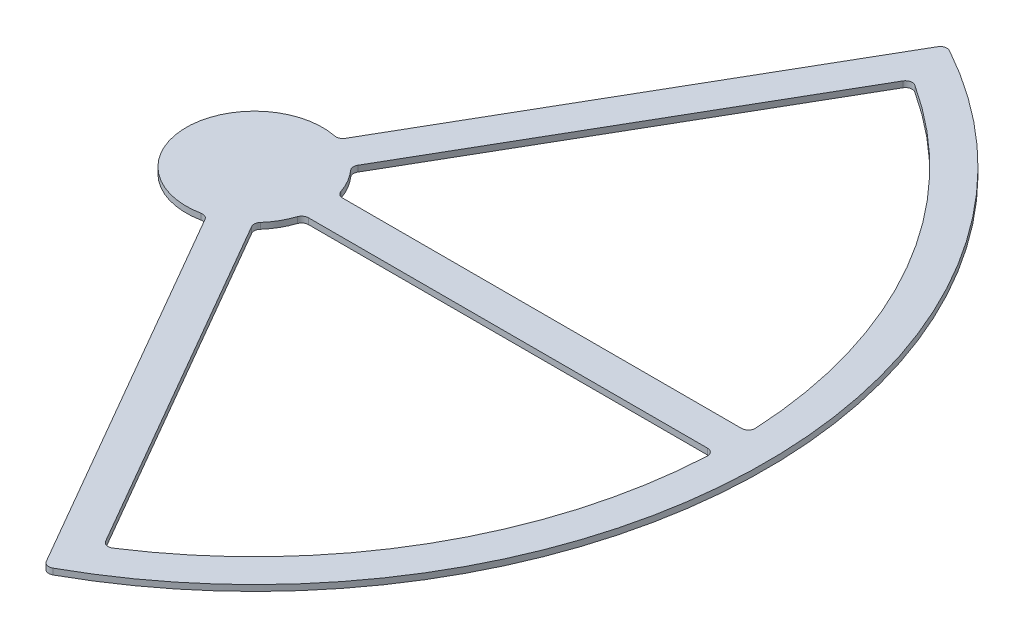
ISO-10303-21;
HEADER;
FILE_DESCRIPTION(('STEP AP214'),'2;1');
FILE_NAME('part.step','',(''),(''),'','','');
FILE_SCHEMA(('AUTOMOTIVE_DESIGN { 1 0 10303 214 1 1 1 1 }'));
ENDSEC;
DATA;
#1=APPLICATION_CONTEXT('core data for automotive mechanical design processes');
#2=APPLICATION_PROTOCOL_DEFINITION('international standard','automotive_design',2000,#1);
#3=PRODUCT_CONTEXT('',#1,'mechanical');
#4=PRODUCT('Part','Part','',(#3));
#5=PRODUCT_RELATED_PRODUCT_CATEGORY('part','',(#4));
#6=PRODUCT_DEFINITION_FORMATION('','',#4);
#7=PRODUCT_DEFINITION_CONTEXT('part definition',#1,'design');
#8=PRODUCT_DEFINITION('design','',#6,#7);
#9=PRODUCT_DEFINITION_SHAPE('','',#8);
#10=(LENGTH_UNIT() NAMED_UNIT(*) SI_UNIT(.MILLI.,.METRE.));
#11=(NAMED_UNIT(*) PLANE_ANGLE_UNIT() SI_UNIT($,.RADIAN.));
#12=(NAMED_UNIT(*) SI_UNIT($,.STERADIAN.) SOLID_ANGLE_UNIT());
#13=UNCERTAINTY_MEASURE_WITH_UNIT(LENGTH_MEASURE(1.E-05),#10,'distance_accuracy_value','');
#14=(GEOMETRIC_REPRESENTATION_CONTEXT(3) GLOBAL_UNCERTAINTY_ASSIGNED_CONTEXT((#13)) GLOBAL_UNIT_ASSIGNED_CONTEXT((#10,
#11,#12)) REPRESENTATION_CONTEXT('',''));
#15=CARTESIAN_POINT('',(0.,0.,0.));
#16=DIRECTION('',(0.,0.,1.));
#17=DIRECTION('',(1.,0.,0.));
#18=AXIS2_PLACEMENT_3D('',#15,#16,#17);
#19=CARTESIAN_POINT('',(71.3867195239865,1.75,129.645425201214));
#20=DIRECTION('',(0.,1.,0.));
#21=DIRECTION('',(0.,0.,1.));
#22=AXIS2_PLACEMENT_3D('',#19,#20,#21);
#23=PLANE('',#22);
#24=CARTESIAN_POINT('',(0.,1.75,0.));
#25=DIRECTION('',(0.,1.,0.));
#26=DIRECTION('',(0.,0.,1.));
#27=AXIS2_PLACEMENT_3D('',#24,#25,#26);
#28=CIRCLE('',#27,140.);
#29=CARTESIAN_POINT('',(76.0599228637533,1.75,117.536752269066));
#30=VERTEX_POINT('',#29);
#31=CARTESIAN_POINT('',(139.819774775206,1.75,7.10144927536232));
#32=VERTEX_POINT('',#31);
#33=EDGE_CURVE('E261',#30,#32,#28,.T.);
#34=ORIENTED_EDGE('',*,*,#33,.F.);
#35=CARTESIAN_POINT('',(74.9733525371282,1.75,115.85765580808));
#36=DIRECTION('',(0.,1.,0.));
#37=DIRECTION('',(0.,0.,1.));
#38=AXIS2_PLACEMENT_3D('',#35,#36,#37);
#39=CIRCLE('',#38,2.00000000000002);
#40=CARTESIAN_POINT('',(73.2413017295594,1.75,116.85765580808));
#41=VERTEX_POINT('',#40);
#42=EDGE_CURVE('E259',#41,#30,#39,.T.);
#43=ORIENTED_EDGE('',*,*,#42,.F.);
#44=DIRECTION('',(0.499999999999998,0.,0.86602540378444));
#45=VECTOR('',#44,1.);
#46=CARTESIAN_POINT('',(14.7584538262293,1.75,15.5623918681885));
#47=LINE('',#46,#45);
#48=CARTESIAN_POINT('',(14.7584538262293,1.75,15.5623918681885));
#49=VERTEX_POINT('',#48);
#50=EDGE_CURVE('E275',#49,#41,#47,.T.);
#51=ORIENTED_EDGE('',*,*,#50,.F.);
#52=CARTESIAN_POINT('',(16.4905046337981,1.75,14.5623918681885));
#53=DIRECTION('',(0.,1.,0.));
#54=DIRECTION('',(0.,0.,-1.));
#55=AXIS2_PLACEMENT_3D('',#52,#53,#54);
#56=CIRCLE('',#55,2.);
#57=CARTESIAN_POINT('',(14.9913678489074,1.75,13.2385380619895));
#58=VERTEX_POINT('',#57);
#59=EDGE_CURVE('E272',#58,#49,#56,.T.);
#60=ORIENTED_EDGE('',*,*,#59,.F.);
#61=CARTESIAN_POINT('',(0.,1.75,0.));
#62=DIRECTION('',(0.,-1.,0.));
#63=DIRECTION('',(0.,0.,1.));
#64=AXIS2_PLACEMENT_3D('',#61,#62,#63);
#65=CIRCLE('',#64,20.);
#66=CARTESIAN_POINT('',(18.9605941951038,1.75,6.36363636363636));
#67=VERTEX_POINT('',#66);
#68=EDGE_CURVE('E270',#67,#58,#65,.T.);
#69=ORIENTED_EDGE('',*,*,#68,.F.);
#70=CARTESIAN_POINT('',(20.8566536146142,1.75,7.));
#71=DIRECTION('',(0.,1.,0.));
#72=DIRECTION('',(0.,0.,1.));
#73=AXIS2_PLACEMENT_3D('',#70,#71,#72);
#74=CIRCLE('',#73,2.);
#75=CARTESIAN_POINT('',(20.8566536146142,1.75,5.));
#76=VERTEX_POINT('',#75);
#77=EDGE_CURVE('E268',#76,#67,#74,.T.);
#78=ORIENTED_EDGE('',*,*,#77,.F.);
#79=DIRECTION('',(-1.,0.,0.));
#80=VECTOR('',#79,1.);
#81=CARTESIAN_POINT('',(20.8566536146142,1.75,5.));
#82=LINE('',#81,#80);
#83=CARTESIAN_POINT('',(137.822349421275,1.75,5.));
#84=VERTEX_POINT('',#83);
#85=EDGE_CURVE('E266',#84,#76,#82,.T.);
#86=ORIENTED_EDGE('',*,*,#85,.F.);
#87=CARTESIAN_POINT('',(137.822349421275,1.75,7.));
#88=DIRECTION('',(0.,1.,0.));
#89=DIRECTION('',(0.,0.,-1.));
#90=AXIS2_PLACEMENT_3D('',#87,#88,#89);
#91=CIRCLE('',#90,1.99999999999999);
#92=EDGE_CURVE('E264',#32,#84,#91,.T.);
#93=ORIENTED_EDGE('',*,*,#92,.F.);
#94=EDGE_LOOP('',(#34,#43,#51,#60,#69,#78,#86,#93));
#95=FACE_BOUND('',#94,.T.);
#96=CARTESIAN_POINT('',(71.3867195239865,1.75,129.645425201214));
#97=DIRECTION('',(0.,1.,0.));
#98=DIRECTION('',(0.,0.,1.));
#99=AXIS2_PLACEMENT_3D('',#96,#97,#98);
#100=CIRCLE('',#99,2.00000000000003);
#101=CARTESIAN_POINT('',(69.6546687164176,1.75,130.645425201214));
#102=VERTEX_POINT('',#101);
#103=CARTESIAN_POINT('',(72.3514049229593,1.75,131.397390406636));
#104=VERTEX_POINT('',#103);
#105=EDGE_CURVE('E318',#102,#104,#100,.T.);
#106=ORIENTED_EDGE('',*,*,#105,.T.);
#107=CARTESIAN_POINT('',(0.,1.75,0.));
#108=DIRECTION('',(0.,1.,0.));
#109=DIRECTION('',(0.,0.,1.));
#110=AXIS2_PLACEMENT_3D('',#107,#108,#109);
#111=CIRCLE('',#110,150.);
#112=CARTESIAN_POINT('',(72.3514049229592,1.75,-131.397390406636));
#113=VERTEX_POINT('',#112);
#114=EDGE_CURVE('E321',#104,#113,#111,.T.);
#115=ORIENTED_EDGE('',*,*,#114,.T.);
#116=CARTESIAN_POINT('',(71.3867195239865,1.75,-129.645425201214));
#117=DIRECTION('',(0.,1.,0.));
#118=DIRECTION('',(0.,0.,-1.));
#119=AXIS2_PLACEMENT_3D('',#116,#117,#118);
#120=CIRCLE('',#119,1.99999999999998);
#121=CARTESIAN_POINT('',(69.6546687164176,1.75,-130.645425201214));
#122=VERTEX_POINT('',#121);
#123=EDGE_CURVE('E324',#113,#122,#120,.T.);
#124=ORIENTED_EDGE('',*,*,#123,.T.);
#125=DIRECTION('',(-0.499999999999998,0.,0.86602540378444));
#126=VECTOR('',#125,1.);
#127=CARTESIAN_POINT('',(6.09819978838486,1.75,-20.5623918681885));
#128=LINE('',#127,#126);
#129=CARTESIAN_POINT('',(6.09819978838486,1.75,-20.5623918681885));
#130=VERTEX_POINT('',#129);
#131=EDGE_CURVE('E326',#122,#130,#128,.T.);
#132=ORIENTED_EDGE('',*,*,#131,.T.);
#133=CARTESIAN_POINT('',(4.36614898081598,1.75,-21.5623918681885));
#134=DIRECTION('',(0.,-1.,0.));
#135=DIRECTION('',(0.,0.,-1.));
#136=AXIS2_PLACEMENT_3D('',#133,#134,#135);
#137=CIRCLE('',#136,2.);
#138=CARTESIAN_POINT('',(3.96922634619634,1.75,-19.6021744256259));
#139=VERTEX_POINT('',#138);
#140=EDGE_CURVE('E328',#130,#139,#137,.T.);
#141=ORIENTED_EDGE('',*,*,#140,.T.);
#142=CARTESIAN_POINT('',(0.,1.75,0.));
#143=DIRECTION('',(0.,1.,0.));
#144=DIRECTION('',(0.,0.,1.));
#145=AXIS2_PLACEMENT_3D('',#142,#143,#144);
#146=CIRCLE('',#145,20.);
#147=CARTESIAN_POINT('',(3.96922634619635,1.75,19.6021744256259));
#148=VERTEX_POINT('',#147);
#149=EDGE_CURVE('E330',#139,#148,#146,.T.);
#150=ORIENTED_EDGE('',*,*,#149,.T.);
#151=CARTESIAN_POINT('',(4.36614898081599,1.75,21.5623918681885));
#152=DIRECTION('',(0.,-1.,0.));
#153=DIRECTION('',(0.,0.,1.));
#154=AXIS2_PLACEMENT_3D('',#151,#152,#153);
#155=CIRCLE('',#154,2.);
#156=CARTESIAN_POINT('',(6.09819978838487,1.75,20.5623918681885));
#157=VERTEX_POINT('',#156);
#158=EDGE_CURVE('E332',#148,#157,#155,.T.);
#159=ORIENTED_EDGE('',*,*,#158,.T.);
#160=DIRECTION('',(0.499999999999998,0.,0.86602540378444));
#161=VECTOR('',#160,1.);
#162=CARTESIAN_POINT('',(6.09819978838487,1.75,20.5623918681885));
#163=LINE('',#162,#161);
#164=EDGE_CURVE('E334',#157,#102,#163,.T.);
#165=ORIENTED_EDGE('',*,*,#164,.T.);
#166=EDGE_LOOP('',(#106,#115,#124,#132,#141,#150,#159,#165));
#167=FACE_BOUND('',#166,.T.);
#168=DIRECTION('',(-0.499999999999998,0.,0.86602540378444));
#169=VECTOR('',#168,1.);
#170=CARTESIAN_POINT('',(14.7584538262293,1.75,-15.5623918681885));
#171=LINE('',#170,#169);
#172=CARTESIAN_POINT('',(73.2413017295594,1.75,-116.85765580808));
#173=VERTEX_POINT('',#172);
#174=CARTESIAN_POINT('',(14.7584538262293,1.75,-15.5623918681885));
#175=VERTEX_POINT('',#174);
#176=EDGE_CURVE('E202',#173,#175,#171,.T.);
#177=ORIENTED_EDGE('',*,*,#176,.F.);
#178=CARTESIAN_POINT('',(74.9733525371282,1.75,-115.85765580808));
#179=DIRECTION('',(0.,1.,0.));
#180=DIRECTION('',(0.,0.,-1.));
#181=AXIS2_PLACEMENT_3D('',#178,#179,#180);
#182=CIRCLE('',#181,1.99999999999999);
#183=CARTESIAN_POINT('',(76.0599228637533,1.75,-117.536752269066));
#184=VERTEX_POINT('',#183);
#185=EDGE_CURVE('E194',#184,#173,#182,.T.);
#186=ORIENTED_EDGE('',*,*,#185,.F.);
#187=CARTESIAN_POINT('',(0.,1.75,0.));
#188=DIRECTION('',(0.,1.,0.));
#189=DIRECTION('',(0.,0.,1.));
#190=AXIS2_PLACEMENT_3D('',#187,#188,#189);
#191=CIRCLE('',#190,140.);
#192=CARTESIAN_POINT('',(139.819774775206,1.75,-7.10144927536232));
#193=VERTEX_POINT('',#192);
#194=EDGE_CURVE('E227',#193,#184,#191,.T.);
#195=ORIENTED_EDGE('',*,*,#194,.F.);
#196=CARTESIAN_POINT('',(137.822349421275,1.75,-7.));
#197=DIRECTION('',(0.,1.,0.));
#198=DIRECTION('',(0.,0.,1.));
#199=AXIS2_PLACEMENT_3D('',#196,#197,#198);
#200=CIRCLE('',#199,1.99999999999999);
#201=CARTESIAN_POINT('',(137.822349421275,1.75,-5.));
#202=VERTEX_POINT('',#201);
#203=EDGE_CURVE('E225',#202,#193,#200,.T.);
#204=ORIENTED_EDGE('',*,*,#203,.F.);
#205=DIRECTION('',(1.,0.,0.));
#206=VECTOR('',#205,1.);
#207=CARTESIAN_POINT('',(20.8566536146142,1.75,-5.));
#208=LINE('',#207,#206);
#209=CARTESIAN_POINT('',(20.8566536146142,1.75,-5.));
#210=VERTEX_POINT('',#209);
#211=EDGE_CURVE('E223',#210,#202,#208,.T.);
#212=ORIENTED_EDGE('',*,*,#211,.F.);
#213=CARTESIAN_POINT('',(20.8566536146142,1.75,-7.));
#214=DIRECTION('',(0.,1.,0.));
#215=DIRECTION('',(0.,0.,-1.));
#216=AXIS2_PLACEMENT_3D('',#213,#214,#215);
#217=CIRCLE('',#216,2.);
#218=CARTESIAN_POINT('',(18.9605941951038,1.75,-6.36363636363637));
#219=VERTEX_POINT('',#218);
#220=EDGE_CURVE('E221',#219,#210,#217,.T.);
#221=ORIENTED_EDGE('',*,*,#220,.F.);
#222=CARTESIAN_POINT('',(0.,1.75,0.));
#223=DIRECTION('',(0.,-1.,0.));
#224=DIRECTION('',(0.,0.,1.));
#225=AXIS2_PLACEMENT_3D('',#222,#223,#224);
#226=CIRCLE('',#225,20.);
#227=CARTESIAN_POINT('',(14.9913678489074,1.75,-13.2385380619895));
#228=VERTEX_POINT('',#227);
#229=EDGE_CURVE('E217',#228,#219,#226,.T.);
#230=ORIENTED_EDGE('',*,*,#229,.F.);
#231=CARTESIAN_POINT('',(16.4905046337981,1.75,-14.5623918681885));
#232=DIRECTION('',(0.,1.,0.));
#233=DIRECTION('',(0.,0.,1.));
#234=AXIS2_PLACEMENT_3D('',#231,#232,#233);
#235=CIRCLE('',#234,2.);
#236=EDGE_CURVE('E215',#175,#228,#235,.T.);
#237=ORIENTED_EDGE('',*,*,#236,.F.);
#238=EDGE_LOOP('',(#177,#186,#195,#204,#212,#221,#230,#237));
#239=FACE_BOUND('',#238,.T.);
#240=ADVANCED_FACE('F33',(#95,#167,#239),#23,.T.);
#241=CARTESIAN_POINT('',(71.3867195239865,0.,129.645425201214));
#242=DIRECTION('',(0.,1.,0.));
#243=DIRECTION('',(0.,0.,1.));
#244=AXIS2_PLACEMENT_3D('',#241,#242,#243);
#245=PLANE('',#244);
#246=CARTESIAN_POINT('',(74.9733525371282,0.,115.85765580808));
#247=DIRECTION('',(0.,1.,0.));
#248=DIRECTION('',(0.,0.,1.));
#249=AXIS2_PLACEMENT_3D('',#246,#247,#248);
#250=CIRCLE('',#249,2.00000000000002);
#251=CARTESIAN_POINT('',(73.2413017295594,0.,116.85765580808));
#252=VERTEX_POINT('',#251);
#253=CARTESIAN_POINT('',(76.0599228637533,0.,117.536752269066));
#254=VERTEX_POINT('',#253);
#255=EDGE_CURVE('E210',#252,#254,#250,.T.);
#256=ORIENTED_EDGE('',*,*,#255,.T.);
#257=CARTESIAN_POINT('',(0.,0.,0.));
#258=DIRECTION('',(0.,1.,0.));
#259=DIRECTION('',(0.,0.,1.));
#260=AXIS2_PLACEMENT_3D('',#257,#258,#259);
#261=CIRCLE('',#260,140.);
#262=CARTESIAN_POINT('',(139.819774775206,0.,7.10144927536232));
#263=VERTEX_POINT('',#262);
#264=EDGE_CURVE('E280',#254,#263,#261,.T.);
#265=ORIENTED_EDGE('',*,*,#264,.T.);
#266=CARTESIAN_POINT('',(137.822349421275,0.,7.));
#267=DIRECTION('',(0.,1.,0.));
#268=DIRECTION('',(0.,0.,-1.));
#269=AXIS2_PLACEMENT_3D('',#266,#267,#268);
#270=CIRCLE('',#269,1.99999999999999);
#271=CARTESIAN_POINT('',(137.822349421275,0.,5.));
#272=VERTEX_POINT('',#271);
#273=EDGE_CURVE('E283',#263,#272,#270,.T.);
#274=ORIENTED_EDGE('',*,*,#273,.T.);
#275=DIRECTION('',(-1.,0.,0.));
#276=VECTOR('',#275,1.);
#277=CARTESIAN_POINT('',(20.8566536146142,0.,5.));
#278=LINE('',#277,#276);
#279=CARTESIAN_POINT('',(20.8566536146142,0.,5.));
#280=VERTEX_POINT('',#279);
#281=EDGE_CURVE('E286',#272,#280,#278,.T.);
#282=ORIENTED_EDGE('',*,*,#281,.T.);
#283=CARTESIAN_POINT('',(20.8566536146142,0.,7.));
#284=DIRECTION('',(0.,1.,0.));
#285=DIRECTION('',(0.,0.,1.));
#286=AXIS2_PLACEMENT_3D('',#283,#284,#285);
#287=CIRCLE('',#286,2.);
#288=CARTESIAN_POINT('',(18.9605941951038,0.,6.36363636363636));
#289=VERTEX_POINT('',#288);
#290=EDGE_CURVE('E289',#280,#289,#287,.T.);
#291=ORIENTED_EDGE('',*,*,#290,.T.);
#292=CARTESIAN_POINT('',(0.,0.,0.));
#293=DIRECTION('',(0.,-1.,0.));
#294=DIRECTION('',(0.,0.,1.));
#295=AXIS2_PLACEMENT_3D('',#292,#293,#294);
#296=CIRCLE('',#295,20.);
#297=CARTESIAN_POINT('',(14.9913678489074,0.,13.2385380619895));
#298=VERTEX_POINT('',#297);
#299=EDGE_CURVE('E292',#289,#298,#296,.T.);
#300=ORIENTED_EDGE('',*,*,#299,.T.);
#301=CARTESIAN_POINT('',(16.4905046337981,0.,14.5623918681885));
#302=DIRECTION('',(0.,1.,0.));
#303=DIRECTION('',(0.,0.,-1.));
#304=AXIS2_PLACEMENT_3D('',#301,#302,#303);
#305=CIRCLE('',#304,2.);
#306=CARTESIAN_POINT('',(14.7584538262293,0.,15.5623918681885));
#307=VERTEX_POINT('',#306);
#308=EDGE_CURVE('E295',#298,#307,#305,.T.);
#309=ORIENTED_EDGE('',*,*,#308,.T.);
#310=DIRECTION('',(0.499999999999998,0.,0.86602540378444));
#311=VECTOR('',#310,1.);
#312=CARTESIAN_POINT('',(14.7584538262293,0.,15.5623918681885));
#313=LINE('',#312,#311);
#314=EDGE_CURVE('E262',#307,#252,#313,.T.);
#315=ORIENTED_EDGE('',*,*,#314,.T.);
#316=EDGE_LOOP('',(#256,#265,#274,#282,#291,#300,#309,#315));
#317=FACE_BOUND('',#316,.T.);
#318=CARTESIAN_POINT('',(71.3867195239865,0.,129.645425201214));
#319=DIRECTION('',(0.,1.,0.));
#320=DIRECTION('',(0.,0.,1.));
#321=AXIS2_PLACEMENT_3D('',#318,#319,#320);
#322=CIRCLE('',#321,2.00000000000003);
#323=CARTESIAN_POINT('',(69.6546687164176,0.,130.645425201214));
#324=VERTEX_POINT('',#323);
#325=CARTESIAN_POINT('',(72.3514049229593,0.,131.397390406636));
#326=VERTEX_POINT('',#325);
#327=EDGE_CURVE('E317',#324,#326,#322,.T.);
#328=ORIENTED_EDGE('',*,*,#327,.F.);
#329=DIRECTION('',(0.499999999999998,0.,0.86602540378444));
#330=VECTOR('',#329,1.);
#331=CARTESIAN_POINT('',(6.09819978838487,0.,20.5623918681885));
#332=LINE('',#331,#330);
#333=CARTESIAN_POINT('',(6.09819978838487,0.,20.5623918681885));
#334=VERTEX_POINT('',#333);
#335=EDGE_CURVE('E322',#334,#324,#332,.T.);
#336=ORIENTED_EDGE('',*,*,#335,.F.);
#337=CARTESIAN_POINT('',(4.36614898081599,0.,21.5623918681885));
#338=DIRECTION('',(0.,-1.,0.));
#339=DIRECTION('',(0.,0.,1.));
#340=AXIS2_PLACEMENT_3D('',#337,#338,#339);
#341=CIRCLE('',#340,2.);
#342=CARTESIAN_POINT('',(3.96922634619635,0.,19.6021744256259));
#343=VERTEX_POINT('',#342);
#344=EDGE_CURVE('E349',#343,#334,#341,.T.);
#345=ORIENTED_EDGE('',*,*,#344,.F.);
#346=CARTESIAN_POINT('',(0.,0.,0.));
#347=DIRECTION('',(0.,1.,0.));
#348=DIRECTION('',(0.,0.,1.));
#349=AXIS2_PLACEMENT_3D('',#346,#347,#348);
#350=CIRCLE('',#349,20.);
#351=CARTESIAN_POINT('',(3.96922634619634,0.,-19.6021744256259));
#352=VERTEX_POINT('',#351);
#353=EDGE_CURVE('E347',#352,#343,#350,.T.);
#354=ORIENTED_EDGE('',*,*,#353,.F.);
#355=CARTESIAN_POINT('',(4.36614898081598,0.,-21.5623918681885));
#356=DIRECTION('',(0.,-1.,0.));
#357=DIRECTION('',(0.,0.,-1.));
#358=AXIS2_PLACEMENT_3D('',#355,#356,#357);
#359=CIRCLE('',#358,2.);
#360=CARTESIAN_POINT('',(6.09819978838486,0.,-20.5623918681885));
#361=VERTEX_POINT('',#360);
#362=EDGE_CURVE('E345',#361,#352,#359,.T.);
#363=ORIENTED_EDGE('',*,*,#362,.F.);
#364=DIRECTION('',(-0.499999999999998,0.,0.86602540378444));
#365=VECTOR('',#364,1.);
#366=CARTESIAN_POINT('',(6.09819978838486,0.,-20.5623918681885));
#367=LINE('',#366,#365);
#368=CARTESIAN_POINT('',(69.6546687164176,0.,-130.645425201214));
#369=VERTEX_POINT('',#368);
#370=EDGE_CURVE('E343',#369,#361,#367,.T.);
#371=ORIENTED_EDGE('',*,*,#370,.F.);
#372=CARTESIAN_POINT('',(71.3867195239865,0.,-129.645425201214));
#373=DIRECTION('',(0.,1.,0.));
#374=DIRECTION('',(0.,0.,-1.));
#375=AXIS2_PLACEMENT_3D('',#372,#373,#374);
#376=CIRCLE('',#375,1.99999999999998);
#377=CARTESIAN_POINT('',(72.3514049229592,0.,-131.397390406636));
#378=VERTEX_POINT('',#377);
#379=EDGE_CURVE('E341',#378,#369,#376,.T.);
#380=ORIENTED_EDGE('',*,*,#379,.F.);
#381=CARTESIAN_POINT('',(0.,0.,0.));
#382=DIRECTION('',(0.,1.,0.));
#383=DIRECTION('',(0.,0.,1.));
#384=AXIS2_PLACEMENT_3D('',#381,#382,#383);
#385=CIRCLE('',#384,150.);
#386=EDGE_CURVE('E339',#326,#378,#385,.T.);
#387=ORIENTED_EDGE('',*,*,#386,.F.);
#388=EDGE_LOOP('',(#328,#336,#345,#354,#363,#371,#380,#387));
#389=FACE_BOUND('',#388,.T.);
#390=CARTESIAN_POINT('',(74.9733525371282,0.,-115.85765580808));
#391=DIRECTION('',(0.,1.,0.));
#392=DIRECTION('',(0.,0.,-1.));
#393=AXIS2_PLACEMENT_3D('',#390,#391,#392);
#394=CIRCLE('',#393,1.99999999999999);
#395=CARTESIAN_POINT('',(76.0599228637533,0.,-117.536752269066));
#396=VERTEX_POINT('',#395);
#397=CARTESIAN_POINT('',(73.2413017295594,0.,-116.85765580808));
#398=VERTEX_POINT('',#397);
#399=EDGE_CURVE('E56',#396,#398,#394,.T.);
#400=ORIENTED_EDGE('',*,*,#399,.T.);
#401=DIRECTION('',(-0.499999999999998,0.,0.86602540378444));
#402=VECTOR('',#401,1.);
#403=CARTESIAN_POINT('',(14.7584538262293,0.,-15.5623918681885));
#404=LINE('',#403,#402);
#405=CARTESIAN_POINT('',(14.7584538262293,0.,-15.5623918681885));
#406=VERTEX_POINT('',#405);
#407=EDGE_CURVE('E209',#398,#406,#404,.T.);
#408=ORIENTED_EDGE('',*,*,#407,.T.);
#409=CARTESIAN_POINT('',(16.4905046337981,0.,-14.5623918681885));
#410=DIRECTION('',(0.,1.,0.));
#411=DIRECTION('',(0.,0.,1.));
#412=AXIS2_PLACEMENT_3D('',#409,#410,#411);
#413=CIRCLE('',#412,2.);
#414=CARTESIAN_POINT('',(14.9913678489074,0.,-13.2385380619895));
#415=VERTEX_POINT('',#414);
#416=EDGE_CURVE('E231',#406,#415,#413,.T.);
#417=ORIENTED_EDGE('',*,*,#416,.T.);
#418=CARTESIAN_POINT('',(0.,0.,0.));
#419=DIRECTION('',(0.,-1.,0.));
#420=DIRECTION('',(0.,0.,1.));
#421=AXIS2_PLACEMENT_3D('',#418,#419,#420);
#422=CIRCLE('',#421,20.);
#423=CARTESIAN_POINT('',(18.9605941951038,0.,-6.36363636363637));
#424=VERTEX_POINT('',#423);
#425=EDGE_CURVE('E234',#415,#424,#422,.T.);
#426=ORIENTED_EDGE('',*,*,#425,.T.);
#427=CARTESIAN_POINT('',(20.8566536146142,0.,-7.));
#428=DIRECTION('',(0.,1.,0.));
#429=DIRECTION('',(0.,0.,-1.));
#430=AXIS2_PLACEMENT_3D('',#427,#428,#429);
#431=CIRCLE('',#430,2.);
#432=CARTESIAN_POINT('',(20.8566536146142,0.,-5.));
#433=VERTEX_POINT('',#432);
#434=EDGE_CURVE('E237',#424,#433,#431,.T.);
#435=ORIENTED_EDGE('',*,*,#434,.T.);
#436=DIRECTION('',(1.,0.,0.));
#437=VECTOR('',#436,1.);
#438=CARTESIAN_POINT('',(20.8566536146142,0.,-5.));
#439=LINE('',#438,#437);
#440=CARTESIAN_POINT('',(137.822349421275,0.,-5.));
#441=VERTEX_POINT('',#440);
#442=EDGE_CURVE('E240',#433,#441,#439,.T.);
#443=ORIENTED_EDGE('',*,*,#442,.T.);
#444=CARTESIAN_POINT('',(137.822349421275,0.,-7.));
#445=DIRECTION('',(0.,1.,0.));
#446=DIRECTION('',(0.,0.,1.));
#447=AXIS2_PLACEMENT_3D('',#444,#445,#446);
#448=CIRCLE('',#447,1.99999999999999);
#449=CARTESIAN_POINT('',(139.819774775206,0.,-7.10144927536232));
#450=VERTEX_POINT('',#449);
#451=EDGE_CURVE('E243',#441,#450,#448,.T.);
#452=ORIENTED_EDGE('',*,*,#451,.T.);
#453=CARTESIAN_POINT('',(0.,0.,0.));
#454=DIRECTION('',(0.,1.,0.));
#455=DIRECTION('',(0.,0.,1.));
#456=AXIS2_PLACEMENT_3D('',#453,#454,#455);
#457=CIRCLE('',#456,140.);
#458=EDGE_CURVE('E203',#450,#396,#457,.T.);
#459=ORIENTED_EDGE('',*,*,#458,.T.);
#460=EDGE_LOOP('',(#400,#408,#417,#426,#435,#443,#452,#459));
#461=FACE_BOUND('',#460,.T.);
#462=ADVANCED_FACE('F379',(#317,#389,#461),#245,.F.);
#463=CARTESIAN_POINT('',(71.3867195239865,1.75,129.645425201214));
#464=DIRECTION('',(0.,-1.,0.));
#465=DIRECTION('',(0.,0.,-1.));
#466=AXIS2_PLACEMENT_3D('',#463,#464,#465);
#467=CYLINDRICAL_SURFACE('',#466,2.00000000000003);
#468=ORIENTED_EDGE('',*,*,#327,.T.);
#469=DIRECTION('',(0.,-1.,0.));
#470=VECTOR('',#469,1.);
#471=CARTESIAN_POINT('',(72.3514049229593,1.75,131.397390406636));
#472=LINE('',#471,#470);
#473=EDGE_CURVE('E11',#104,#326,#472,.T.);
#474=ORIENTED_EDGE('',*,*,#473,.F.);
#475=ORIENTED_EDGE('',*,*,#105,.F.);
#476=DIRECTION('',(0.,-1.,0.));
#477=VECTOR('',#476,1.);
#478=CARTESIAN_POINT('',(69.6546687164176,1.75,130.645425201214));
#479=LINE('',#478,#477);
#480=EDGE_CURVE('E336',#102,#324,#479,.T.);
#481=ORIENTED_EDGE('',*,*,#480,.T.);
#482=EDGE_LOOP('',(#468,#474,#475,#481));
#483=FACE_BOUND('',#482,.T.);
#484=ADVANCED_FACE('F35',(#483),#467,.T.);
#485=CARTESIAN_POINT('',(0.,1.75,0.));
#486=DIRECTION('',(0.,-1.,0.));
#487=DIRECTION('',(0.,0.,-1.));
#488=AXIS2_PLACEMENT_3D('',#485,#486,#487);
#489=CYLINDRICAL_SURFACE('',#488,150.);
#490=ORIENTED_EDGE('',*,*,#386,.T.);
#491=DIRECTION('',(0.,-1.,0.));
#492=VECTOR('',#491,1.);
#493=CARTESIAN_POINT('',(72.3514049229592,1.75,-131.397390406636));
#494=LINE('',#493,#492);
#495=EDGE_CURVE('E41',#113,#378,#494,.T.);
#496=ORIENTED_EDGE('',*,*,#495,.F.);
#497=ORIENTED_EDGE('',*,*,#114,.F.);
#498=ORIENTED_EDGE('',*,*,#473,.T.);
#499=EDGE_LOOP('',(#490,#496,#497,#498));
#500=FACE_BOUND('',#499,.T.);
#501=ADVANCED_FACE('F396',(#500),#489,.T.);
#502=CARTESIAN_POINT('',(71.3867195239865,1.75,-129.645425201214));
#503=DIRECTION('',(0.,-1.,0.));
#504=DIRECTION('',(0.,0.,-1.));
#505=AXIS2_PLACEMENT_3D('',#502,#503,#504);
#506=CYLINDRICAL_SURFACE('',#505,1.99999999999998);
#507=ORIENTED_EDGE('',*,*,#379,.T.);
#508=DIRECTION('',(0.,-1.,0.));
#509=VECTOR('',#508,1.);
#510=CARTESIAN_POINT('',(69.6546687164176,1.75,-130.645425201214));
#511=LINE('',#510,#509);
#512=EDGE_CURVE('E366',#122,#369,#511,.T.);
#513=ORIENTED_EDGE('',*,*,#512,.F.);
#514=ORIENTED_EDGE('',*,*,#123,.F.);
#515=ORIENTED_EDGE('',*,*,#495,.T.);
#516=EDGE_LOOP('',(#507,#513,#514,#515));
#517=FACE_BOUND('',#516,.T.);
#518=ADVANCED_FACE('F373',(#517),#506,.T.);
#519=CARTESIAN_POINT('',(6.09819978838486,1.75,-20.5623918681885));
#520=DIRECTION('',(0.86602540378444,0.,0.499999999999998));
#521=DIRECTION('',(0.499999999999998,0.,-0.86602540378444));
#522=AXIS2_PLACEMENT_3D('',#519,#520,#521);
#523=PLANE('',#522);
#524=ORIENTED_EDGE('',*,*,#370,.T.);
#525=DIRECTION('',(0.,-1.,0.));
#526=VECTOR('',#525,1.);
#527=CARTESIAN_POINT('',(6.09819978838486,1.75,-20.5623918681885));
#528=LINE('',#527,#526);
#529=EDGE_CURVE('E363',#130,#361,#528,.T.);
#530=ORIENTED_EDGE('',*,*,#529,.F.);
#531=ORIENTED_EDGE('',*,*,#131,.F.);
#532=ORIENTED_EDGE('',*,*,#512,.T.);
#533=EDGE_LOOP('',(#524,#530,#531,#532));
#534=FACE_BOUND('',#533,.T.);
#535=ADVANCED_FACE('F385',(#534),#523,.F.);
#536=CARTESIAN_POINT('',(4.36614898081598,1.75,-21.5623918681885));
#537=DIRECTION('',(0.,-1.,0.));
#538=DIRECTION('',(0.,0.,-1.));
#539=AXIS2_PLACEMENT_3D('',#536,#537,#538);
#540=CYLINDRICAL_SURFACE('',#539,2.);
#541=ORIENTED_EDGE('',*,*,#362,.T.);
#542=DIRECTION('',(0.,-1.,0.));
#543=VECTOR('',#542,1.);
#544=CARTESIAN_POINT('',(3.96922634619634,1.75,-19.6021744256259));
#545=LINE('',#544,#543);
#546=EDGE_CURVE('E360',#139,#352,#545,.T.);
#547=ORIENTED_EDGE('',*,*,#546,.F.);
#548=ORIENTED_EDGE('',*,*,#140,.F.);
#549=ORIENTED_EDGE('',*,*,#529,.T.);
#550=EDGE_LOOP('',(#541,#547,#548,#549));
#551=FACE_BOUND('',#550,.T.);
#552=ADVANCED_FACE('F389',(#551),#540,.F.);
#553=CARTESIAN_POINT('',(0.,1.75,0.));
#554=DIRECTION('',(0.,-1.,0.));
#555=DIRECTION('',(0.,0.,-1.));
#556=AXIS2_PLACEMENT_3D('',#553,#554,#555);
#557=CYLINDRICAL_SURFACE('',#556,20.);
#558=ORIENTED_EDGE('',*,*,#353,.T.);
#559=DIRECTION('',(0.,-1.,0.));
#560=VECTOR('',#559,1.);
#561=CARTESIAN_POINT('',(3.96922634619635,1.75,19.6021744256259));
#562=LINE('',#561,#560);
#563=EDGE_CURVE('E357',#148,#343,#562,.T.);
#564=ORIENTED_EDGE('',*,*,#563,.F.);
#565=ORIENTED_EDGE('',*,*,#149,.F.);
#566=ORIENTED_EDGE('',*,*,#546,.T.);
#567=EDGE_LOOP('',(#558,#564,#565,#566));
#568=FACE_BOUND('',#567,.T.);
#569=ADVANCED_FACE('F409',(#568),#557,.T.);
#570=CARTESIAN_POINT('',(4.36614898081599,1.75,21.5623918681885));
#571=DIRECTION('',(0.,-1.,0.));
#572=DIRECTION('',(0.,0.,-1.));
#573=AXIS2_PLACEMENT_3D('',#570,#571,#572);
#574=CYLINDRICAL_SURFACE('',#573,2.);
#575=ORIENTED_EDGE('',*,*,#344,.T.);
#576=DIRECTION('',(0.,-1.,0.));
#577=VECTOR('',#576,1.);
#578=CARTESIAN_POINT('',(6.09819978838487,1.75,20.5623918681885));
#579=LINE('',#578,#577);
#580=EDGE_CURVE('E354',#157,#334,#579,.T.);
#581=ORIENTED_EDGE('',*,*,#580,.F.);
#582=ORIENTED_EDGE('',*,*,#158,.F.);
#583=ORIENTED_EDGE('',*,*,#563,.T.);
#584=EDGE_LOOP('',(#575,#581,#582,#583));
#585=FACE_BOUND('',#584,.T.);
#586=ADVANCED_FACE('F407',(#585),#574,.F.);
#587=CARTESIAN_POINT('',(6.09819978838487,1.75,20.5623918681885));
#588=DIRECTION('',(0.86602540378444,0.,-0.499999999999998));
#589=DIRECTION('',(-0.499999999999998,0.,-0.86602540378444));
#590=AXIS2_PLACEMENT_3D('',#587,#588,#589);
#591=PLANE('',#590);
#592=ORIENTED_EDGE('',*,*,#335,.T.);
#593=ORIENTED_EDGE('',*,*,#480,.F.);
#594=ORIENTED_EDGE('',*,*,#164,.F.);
#595=ORIENTED_EDGE('',*,*,#580,.T.);
#596=EDGE_LOOP('',(#592,#593,#594,#595));
#597=FACE_BOUND('',#596,.T.);
#598=ADVANCED_FACE('F402',(#597),#591,.F.);
#599=CARTESIAN_POINT('',(74.9733525371282,1.75,115.85765580808));
#600=DIRECTION('',(0.,-1.,0.));
#601=DIRECTION('',(0.,0.,-1.));
#602=AXIS2_PLACEMENT_3D('',#599,#600,#601);
#603=CYLINDRICAL_SURFACE('',#602,2.00000000000002);
#604=ORIENTED_EDGE('',*,*,#255,.F.);
#605=DIRECTION('',(0.,-1.,0.));
#606=VECTOR('',#605,1.);
#607=CARTESIAN_POINT('',(73.2413017295594,1.75,116.85765580808));
#608=LINE('',#607,#606);
#609=EDGE_CURVE('E277',#41,#252,#608,.T.);
#610=ORIENTED_EDGE('',*,*,#609,.F.);
#611=ORIENTED_EDGE('',*,*,#42,.T.);
#612=DIRECTION('',(0.,-1.,0.));
#613=VECTOR('',#612,1.);
#614=CARTESIAN_POINT('',(76.0599228637533,1.75,117.536752269066));
#615=LINE('',#614,#613);
#616=EDGE_CURVE('E314',#30,#254,#615,.T.);
#617=ORIENTED_EDGE('',*,*,#616,.T.);
#618=EDGE_LOOP('',(#604,#610,#611,#617));
#619=FACE_BOUND('',#618,.T.);
#620=ADVANCED_FACE('F428',(#619),#603,.F.);
#621=CARTESIAN_POINT('',(0.,1.75,0.));
#622=DIRECTION('',(0.,-1.,0.));
#623=DIRECTION('',(0.,0.,-1.));
#624=AXIS2_PLACEMENT_3D('',#621,#622,#623);
#625=CYLINDRICAL_SURFACE('',#624,140.);
#626=ORIENTED_EDGE('',*,*,#264,.F.);
#627=ORIENTED_EDGE('',*,*,#616,.F.);
#628=ORIENTED_EDGE('',*,*,#33,.T.);
#629=DIRECTION('',(0.,-1.,0.));
#630=VECTOR('',#629,1.);
#631=CARTESIAN_POINT('',(139.819774775206,1.75,7.10144927536232));
#632=LINE('',#631,#630);
#633=EDGE_CURVE('E312',#32,#263,#632,.T.);
#634=ORIENTED_EDGE('',*,*,#633,.T.);
#635=EDGE_LOOP('',(#626,#627,#628,#634));
#636=FACE_BOUND('',#635,.T.);
#637=ADVANCED_FACE('F435',(#636),#625,.F.);
#638=CARTESIAN_POINT('',(137.822349421275,1.75,7.));
#639=DIRECTION('',(0.,-1.,0.));
#640=DIRECTION('',(0.,0.,-1.));
#641=AXIS2_PLACEMENT_3D('',#638,#639,#640);
#642=CYLINDRICAL_SURFACE('',#641,1.99999999999999);
#643=ORIENTED_EDGE('',*,*,#273,.F.);
#644=ORIENTED_EDGE('',*,*,#633,.F.);
#645=ORIENTED_EDGE('',*,*,#92,.T.);
#646=DIRECTION('',(0.,-1.,0.));
#647=VECTOR('',#646,1.);
#648=CARTESIAN_POINT('',(137.822349421275,1.75,5.));
#649=LINE('',#648,#647);
#650=EDGE_CURVE('E310',#84,#272,#649,.T.);
#651=ORIENTED_EDGE('',*,*,#650,.T.);
#652=EDGE_LOOP('',(#643,#644,#645,#651));
#653=FACE_BOUND('',#652,.T.);
#654=ADVANCED_FACE('F440',(#653),#642,.F.);
#655=CARTESIAN_POINT('',(20.8566536146142,1.75,5.));
#656=DIRECTION('',(0.,0.,1.));
#657=DIRECTION('',(1.,0.,0.));
#658=AXIS2_PLACEMENT_3D('',#655,#656,#657);
#659=PLANE('',#658);
#660=ORIENTED_EDGE('',*,*,#281,.F.);
#661=ORIENTED_EDGE('',*,*,#650,.F.);
#662=ORIENTED_EDGE('',*,*,#85,.T.);
#663=DIRECTION('',(0.,-1.,0.));
#664=VECTOR('',#663,1.);
#665=CARTESIAN_POINT('',(20.8566536146142,1.75,5.));
#666=LINE('',#665,#664);
#667=EDGE_CURVE('E308',#76,#280,#666,.T.);
#668=ORIENTED_EDGE('',*,*,#667,.T.);
#669=EDGE_LOOP('',(#660,#661,#662,#668));
#670=FACE_BOUND('',#669,.T.);
#671=ADVANCED_FACE('F464',(#670),#659,.T.);
#672=CARTESIAN_POINT('',(20.8566536146142,1.75,7.));
#673=DIRECTION('',(0.,-1.,0.));
#674=DIRECTION('',(0.,0.,-1.));
#675=AXIS2_PLACEMENT_3D('',#672,#673,#674);
#676=CYLINDRICAL_SURFACE('',#675,2.);
#677=ORIENTED_EDGE('',*,*,#290,.F.);
#678=ORIENTED_EDGE('',*,*,#667,.F.);
#679=ORIENTED_EDGE('',*,*,#77,.T.);
#680=DIRECTION('',(0.,-1.,0.));
#681=VECTOR('',#680,1.);
#682=CARTESIAN_POINT('',(18.9605941951038,1.75,6.36363636363636));
#683=LINE('',#682,#681);
#684=EDGE_CURVE('E306',#67,#289,#683,.T.);
#685=ORIENTED_EDGE('',*,*,#684,.T.);
#686=EDGE_LOOP('',(#677,#678,#679,#685));
#687=FACE_BOUND('',#686,.T.);
#688=ADVANCED_FACE('F469',(#687),#676,.F.);
#689=CARTESIAN_POINT('',(0.,1.75,0.));
#690=DIRECTION('',(0.,-1.,0.));
#691=DIRECTION('',(0.,0.,-1.));
#692=AXIS2_PLACEMENT_3D('',#689,#690,#691);
#693=CYLINDRICAL_SURFACE('',#692,20.);
#694=ORIENTED_EDGE('',*,*,#299,.F.);
#695=ORIENTED_EDGE('',*,*,#684,.F.);
#696=ORIENTED_EDGE('',*,*,#68,.T.);
#697=DIRECTION('',(0.,-1.,0.));
#698=VECTOR('',#697,1.);
#699=CARTESIAN_POINT('',(14.9913678489074,1.75,13.2385380619895));
#700=LINE('',#699,#698);
#701=EDGE_CURVE('E304',#58,#298,#700,.T.);
#702=ORIENTED_EDGE('',*,*,#701,.T.);
#703=EDGE_LOOP('',(#694,#695,#696,#702));
#704=FACE_BOUND('',#703,.T.);
#705=ADVANCED_FACE('F472',(#704),#693,.T.);
#706=CARTESIAN_POINT('',(16.4905046337981,1.75,14.5623918681885));
#707=DIRECTION('',(0.,-1.,0.));
#708=DIRECTION('',(0.,0.,-1.));
#709=AXIS2_PLACEMENT_3D('',#706,#707,#708);
#710=CYLINDRICAL_SURFACE('',#709,2.);
#711=ORIENTED_EDGE('',*,*,#308,.F.);
#712=ORIENTED_EDGE('',*,*,#701,.F.);
#713=ORIENTED_EDGE('',*,*,#59,.T.);
#714=DIRECTION('',(0.,-1.,0.));
#715=VECTOR('',#714,1.);
#716=CARTESIAN_POINT('',(14.7584538262293,1.75,15.5623918681885));
#717=LINE('',#716,#715);
#718=EDGE_CURVE('E302',#49,#307,#717,.T.);
#719=ORIENTED_EDGE('',*,*,#718,.T.);
#720=EDGE_LOOP('',(#711,#712,#713,#719));
#721=FACE_BOUND('',#720,.T.);
#722=ADVANCED_FACE('F453',(#721),#710,.F.);
#723=CARTESIAN_POINT('',(14.7584538262293,1.75,15.5623918681885));
#724=DIRECTION('',(0.86602540378444,0.,-0.499999999999998));
#725=DIRECTION('',(-0.499999999999998,0.,-0.86602540378444));
#726=AXIS2_PLACEMENT_3D('',#723,#724,#725);
#727=PLANE('',#726);
#728=ORIENTED_EDGE('',*,*,#314,.F.);
#729=ORIENTED_EDGE('',*,*,#718,.F.);
#730=ORIENTED_EDGE('',*,*,#50,.T.);
#731=ORIENTED_EDGE('',*,*,#609,.T.);
#732=EDGE_LOOP('',(#728,#729,#730,#731));
#733=FACE_BOUND('',#732,.T.);
#734=ADVANCED_FACE('F447',(#733),#727,.T.);
#735=CARTESIAN_POINT('',(74.9733525371282,1.75,-115.85765580808));
#736=DIRECTION('',(0.,-1.,0.));
#737=DIRECTION('',(0.,0.,-1.));
#738=AXIS2_PLACEMENT_3D('',#735,#736,#737);
#739=CYLINDRICAL_SURFACE('',#738,1.99999999999999);
#740=ORIENTED_EDGE('',*,*,#399,.F.);
#741=DIRECTION('',(0.,-1.,0.));
#742=VECTOR('',#741,1.);
#743=CARTESIAN_POINT('',(76.0599228637533,1.75,-117.536752269066));
#744=LINE('',#743,#742);
#745=EDGE_CURVE('E198',#184,#396,#744,.T.);
#746=ORIENTED_EDGE('',*,*,#745,.F.);
#747=ORIENTED_EDGE('',*,*,#185,.T.);
#748=DIRECTION('',(0.,-1.,0.));
#749=VECTOR('',#748,1.);
#750=CARTESIAN_POINT('',(73.2413017295594,1.75,-116.85765580808));
#751=LINE('',#750,#749);
#752=EDGE_CURVE('E197',#173,#398,#751,.T.);
#753=ORIENTED_EDGE('',*,*,#752,.T.);
#754=EDGE_LOOP('',(#740,#746,#747,#753));
#755=FACE_BOUND('',#754,.T.);
#756=ADVANCED_FACE('F196',(#755),#739,.F.);
#757=CARTESIAN_POINT('',(14.7584538262293,1.75,-15.5623918681885));
#758=DIRECTION('',(0.86602540378444,0.,0.499999999999998));
#759=DIRECTION('',(0.499999999999998,0.,-0.86602540378444));
#760=AXIS2_PLACEMENT_3D('',#757,#758,#759);
#761=PLANE('',#760);
#762=ORIENTED_EDGE('',*,*,#407,.F.);
#763=ORIENTED_EDGE('',*,*,#752,.F.);
#764=ORIENTED_EDGE('',*,*,#176,.T.);
#765=DIRECTION('',(0.,-1.,0.));
#766=VECTOR('',#765,1.);
#767=CARTESIAN_POINT('',(14.7584538262293,1.75,-15.5623918681885));
#768=LINE('',#767,#766);
#769=EDGE_CURVE('E211',#175,#406,#768,.T.);
#770=ORIENTED_EDGE('',*,*,#769,.T.);
#771=EDGE_LOOP('',(#762,#763,#764,#770));
#772=FACE_BOUND('',#771,.T.);
#773=ADVANCED_FACE('F206',(#772),#761,.T.);
#774=CARTESIAN_POINT('',(16.4905046337981,1.75,-14.5623918681885));
#775=DIRECTION('',(0.,-1.,0.));
#776=DIRECTION('',(0.,0.,-1.));
#777=AXIS2_PLACEMENT_3D('',#774,#775,#776);
#778=CYLINDRICAL_SURFACE('',#777,2.);
#779=ORIENTED_EDGE('',*,*,#416,.F.);
#780=ORIENTED_EDGE('',*,*,#769,.F.);
#781=ORIENTED_EDGE('',*,*,#236,.T.);
#782=DIRECTION('',(0.,-1.,0.));
#783=VECTOR('',#782,1.);
#784=CARTESIAN_POINT('',(14.9913678489074,1.75,-13.2385380619895));
#785=LINE('',#784,#783);
#786=EDGE_CURVE('E256',#228,#415,#785,.T.);
#787=ORIENTED_EDGE('',*,*,#786,.T.);
#788=EDGE_LOOP('',(#779,#780,#781,#787));
#789=FACE_BOUND('',#788,.T.);
#790=ADVANCED_FACE('F532',(#789),#778,.F.);
#791=CARTESIAN_POINT('',(0.,1.75,0.));
#792=DIRECTION('',(0.,-1.,0.));
#793=DIRECTION('',(0.,0.,-1.));
#794=AXIS2_PLACEMENT_3D('',#791,#792,#793);
#795=CYLINDRICAL_SURFACE('',#794,20.);
#796=ORIENTED_EDGE('',*,*,#425,.F.);
#797=ORIENTED_EDGE('',*,*,#786,.F.);
#798=ORIENTED_EDGE('',*,*,#229,.T.);
#799=DIRECTION('',(0.,-1.,0.));
#800=VECTOR('',#799,1.);
#801=CARTESIAN_POINT('',(18.9605941951038,1.75,-6.36363636363637));
#802=LINE('',#801,#800);
#803=EDGE_CURVE('E254',#219,#424,#802,.T.);
#804=ORIENTED_EDGE('',*,*,#803,.T.);
#805=EDGE_LOOP('',(#796,#797,#798,#804));
#806=FACE_BOUND('',#805,.T.);
#807=ADVANCED_FACE('F541',(#806),#795,.T.);
#808=CARTESIAN_POINT('',(20.8566536146142,1.75,-7.));
#809=DIRECTION('',(0.,-1.,0.));
#810=DIRECTION('',(0.,0.,-1.));
#811=AXIS2_PLACEMENT_3D('',#808,#809,#810);
#812=CYLINDRICAL_SURFACE('',#811,2.);
#813=ORIENTED_EDGE('',*,*,#434,.F.);
#814=ORIENTED_EDGE('',*,*,#803,.F.);
#815=ORIENTED_EDGE('',*,*,#220,.T.);
#816=DIRECTION('',(0.,-1.,0.));
#817=VECTOR('',#816,1.);
#818=CARTESIAN_POINT('',(20.8566536146142,1.75,-5.));
#819=LINE('',#818,#817);
#820=EDGE_CURVE('E252',#210,#433,#819,.T.);
#821=ORIENTED_EDGE('',*,*,#820,.T.);
#822=EDGE_LOOP('',(#813,#814,#815,#821));
#823=FACE_BOUND('',#822,.T.);
#824=ADVANCED_FACE('F551',(#823),#812,.F.);
#825=CARTESIAN_POINT('',(20.8566536146142,1.75,-5.));
#826=DIRECTION('',(0.,0.,-1.));
#827=DIRECTION('',(-1.,0.,0.));
#828=AXIS2_PLACEMENT_3D('',#825,#826,#827);
#829=PLANE('',#828);
#830=ORIENTED_EDGE('',*,*,#442,.F.);
#831=ORIENTED_EDGE('',*,*,#820,.F.);
#832=ORIENTED_EDGE('',*,*,#211,.T.);
#833=DIRECTION('',(0.,-1.,0.));
#834=VECTOR('',#833,1.);
#835=CARTESIAN_POINT('',(137.822349421275,1.75,-5.));
#836=LINE('',#835,#834);
#837=EDGE_CURVE('E250',#202,#441,#836,.T.);
#838=ORIENTED_EDGE('',*,*,#837,.T.);
#839=EDGE_LOOP('',(#830,#831,#832,#838));
#840=FACE_BOUND('',#839,.T.);
#841=ADVANCED_FACE('F561',(#840),#829,.T.);
#842=CARTESIAN_POINT('',(137.822349421275,1.75,-7.));
#843=DIRECTION('',(0.,-1.,0.));
#844=DIRECTION('',(0.,0.,-1.));
#845=AXIS2_PLACEMENT_3D('',#842,#843,#844);
#846=CYLINDRICAL_SURFACE('',#845,1.99999999999999);
#847=ORIENTED_EDGE('',*,*,#451,.F.);
#848=ORIENTED_EDGE('',*,*,#837,.F.);
#849=ORIENTED_EDGE('',*,*,#203,.T.);
#850=DIRECTION('',(0.,-1.,0.));
#851=VECTOR('',#850,1.);
#852=CARTESIAN_POINT('',(139.819774775206,1.75,-7.10144927536232));
#853=LINE('',#852,#851);
#854=EDGE_CURVE('E48',#193,#450,#853,.T.);
#855=ORIENTED_EDGE('',*,*,#854,.T.);
#856=EDGE_LOOP('',(#847,#848,#849,#855));
#857=FACE_BOUND('',#856,.T.);
#858=ADVANCED_FACE('F571',(#857),#846,.F.);
#859=CARTESIAN_POINT('',(0.,1.75,0.));
#860=DIRECTION('',(0.,-1.,0.));
#861=DIRECTION('',(0.,0.,-1.));
#862=AXIS2_PLACEMENT_3D('',#859,#860,#861);
#863=CYLINDRICAL_SURFACE('',#862,140.);
#864=ORIENTED_EDGE('',*,*,#458,.F.);
#865=ORIENTED_EDGE('',*,*,#854,.F.);
#866=ORIENTED_EDGE('',*,*,#194,.T.);
#867=ORIENTED_EDGE('',*,*,#745,.T.);
#868=EDGE_LOOP('',(#864,#865,#866,#867));
#869=FACE_BOUND('',#868,.T.);
#870=ADVANCED_FACE('F581',(#869),#863,.F.);
#871=CLOSED_SHELL('',(#240,#462,#484,#501,#518,#535,#552,#569,#586,#598,#620,#637,#654,#671,
#688,#705,#722,#734,#756,#773,#790,#807,#824,#841,#858,#870));
#872=MANIFOLD_SOLID_BREP('B2',#871);
#873=ADVANCED_BREP_SHAPE_REPRESENTATION('',(#18,#872),#14);
#874=SHAPE_DEFINITION_REPRESENTATION(#9,#873);
ENDSEC;
END-ISO-10303-21;
